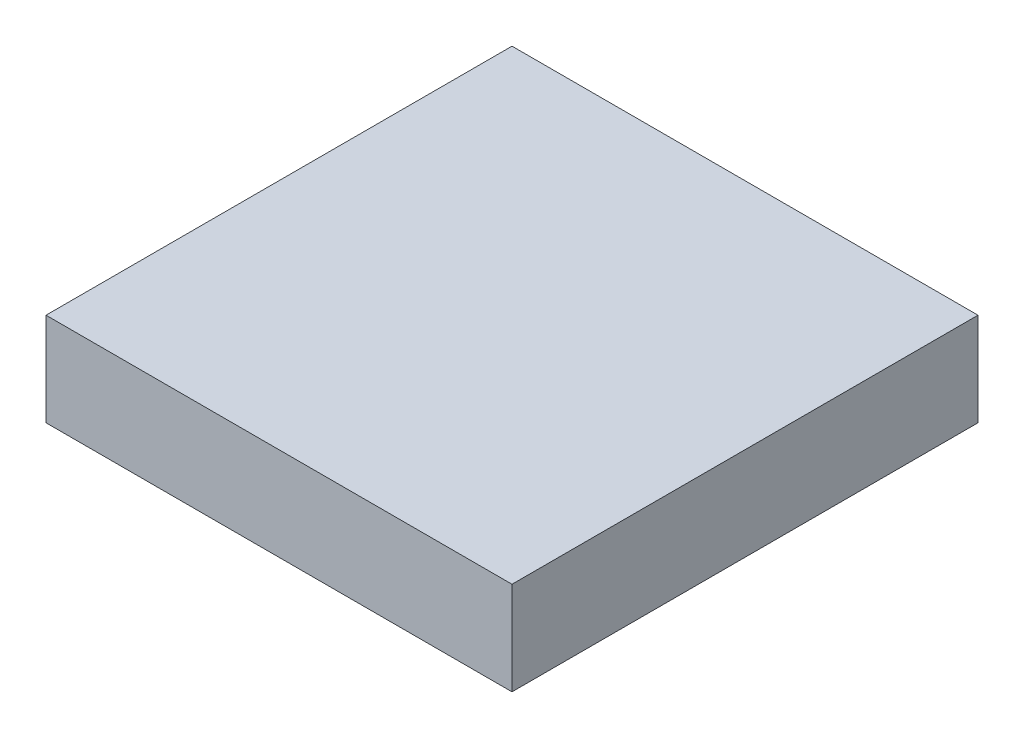
ISO-10303-21;
HEADER;
FILE_DESCRIPTION(('STEP AP214'),'2;1');
FILE_NAME('part.step','',(''),(''),'','','');
FILE_SCHEMA(('AUTOMOTIVE_DESIGN { 1 0 10303 214 1 1 1 1 }'));
ENDSEC;
DATA;
#1=APPLICATION_CONTEXT('core data for automotive mechanical design processes');
#2=APPLICATION_PROTOCOL_DEFINITION('international standard','automotive_design',2000,#1);
#3=PRODUCT_CONTEXT('',#1,'mechanical');
#4=PRODUCT('Part','Part','',(#3));
#5=PRODUCT_RELATED_PRODUCT_CATEGORY('part','',(#4));
#6=PRODUCT_DEFINITION_FORMATION('','',#4);
#7=PRODUCT_DEFINITION_CONTEXT('part definition',#1,'design');
#8=PRODUCT_DEFINITION('design','',#6,#7);
#9=PRODUCT_DEFINITION_SHAPE('','',#8);
#10=(LENGTH_UNIT() NAMED_UNIT(*) SI_UNIT(.MILLI.,.METRE.));
#11=(NAMED_UNIT(*) PLANE_ANGLE_UNIT() SI_UNIT($,.RADIAN.));
#12=(NAMED_UNIT(*) SI_UNIT($,.STERADIAN.) SOLID_ANGLE_UNIT());
#13=UNCERTAINTY_MEASURE_WITH_UNIT(LENGTH_MEASURE(1.E-05),#10,'distance_accuracy_value','');
#14=(GEOMETRIC_REPRESENTATION_CONTEXT(3) GLOBAL_UNCERTAINTY_ASSIGNED_CONTEXT((#13)) GLOBAL_UNIT_ASSIGNED_CONTEXT((#10,
#11,#12)) REPRESENTATION_CONTEXT('',''));
#15=CARTESIAN_POINT('',(0.,0.,0.));
#16=DIRECTION('',(0.,0.,1.));
#17=DIRECTION('',(1.,0.,0.));
#18=AXIS2_PLACEMENT_3D('',#15,#16,#17);
#19=CARTESIAN_POINT('',(8.,3.2,8.));
#20=DIRECTION('',(-1.,0.,0.));
#21=DIRECTION('',(0.,0.,1.));
#22=AXIS2_PLACEMENT_3D('',#19,#20,#21);
#23=PLANE('',#22);
#24=DIRECTION('',(0.,0.,-1.));
#25=VECTOR('',#24,1.);
#26=CARTESIAN_POINT('',(8.,0.,8.));
#27=LINE('',#26,#25);
#28=CARTESIAN_POINT('',(8.,0.,8.));
#29=VERTEX_POINT('',#28);
#30=CARTESIAN_POINT('',(8.,0.,-8.));
#31=VERTEX_POINT('',#30);
#32=EDGE_CURVE('E104',#29,#31,#27,.T.);
#33=ORIENTED_EDGE('',*,*,#32,.T.);
#34=DIRECTION('',(0.,-1.,0.));
#35=VECTOR('',#34,1.);
#36=CARTESIAN_POINT('',(8.,3.2,-8.));
#37=LINE('',#36,#35);
#38=CARTESIAN_POINT('',(8.,3.2,-8.));
#39=VERTEX_POINT('',#38);
#40=EDGE_CURVE('E11',#39,#31,#37,.T.);
#41=ORIENTED_EDGE('',*,*,#40,.F.);
#42=DIRECTION('',(0.,0.,-1.));
#43=VECTOR('',#42,1.);
#44=CARTESIAN_POINT('',(8.,3.2,8.));
#45=LINE('',#44,#43);
#46=CARTESIAN_POINT('',(8.,3.2,8.));
#47=VERTEX_POINT('',#46);
#48=EDGE_CURVE('E92',#47,#39,#45,.T.);
#49=ORIENTED_EDGE('',*,*,#48,.F.);
#50=DIRECTION('',(0.,-1.,0.));
#51=VECTOR('',#50,1.);
#52=CARTESIAN_POINT('',(8.,3.2,8.));
#53=LINE('',#52,#51);
#54=EDGE_CURVE('E100',#47,#29,#53,.T.);
#55=ORIENTED_EDGE('',*,*,#54,.T.);
#56=EDGE_LOOP('',(#33,#41,#49,#55));
#57=FACE_BOUND('',#56,.T.);
#58=ADVANCED_FACE('F41',(#57),#23,.F.);
#59=CARTESIAN_POINT('',(-8.,3.2,-8.));
#60=DIRECTION('',(0.,0.,1.));
#61=DIRECTION('',(1.,0.,0.));
#62=AXIS2_PLACEMENT_3D('',#59,#60,#61);
#63=PLANE('',#62);
#64=DIRECTION('',(-1.,0.,0.));
#65=VECTOR('',#64,1.);
#66=CARTESIAN_POINT('',(-8.,0.,-8.));
#67=LINE('',#66,#65);
#68=CARTESIAN_POINT('',(-8.,0.,-8.));
#69=VERTEX_POINT('',#68);
#70=EDGE_CURVE('E96',#31,#69,#67,.T.);
#71=ORIENTED_EDGE('',*,*,#70,.T.);
#72=DIRECTION('',(0.,-1.,0.));
#73=VECTOR('',#72,1.);
#74=CARTESIAN_POINT('',(-8.,3.2,-8.));
#75=LINE('',#74,#73);
#76=CARTESIAN_POINT('',(-8.,3.2,-8.));
#77=VERTEX_POINT('',#76);
#78=EDGE_CURVE('E49',#77,#69,#75,.T.);
#79=ORIENTED_EDGE('',*,*,#78,.F.);
#80=DIRECTION('',(-1.,0.,0.));
#81=VECTOR('',#80,1.);
#82=CARTESIAN_POINT('',(-8.,3.2,-8.));
#83=LINE('',#82,#81);
#84=EDGE_CURVE('E87',#39,#77,#83,.T.);
#85=ORIENTED_EDGE('',*,*,#84,.F.);
#86=ORIENTED_EDGE('',*,*,#40,.T.);
#87=EDGE_LOOP('',(#71,#79,#85,#86));
#88=FACE_BOUND('',#87,.T.);
#89=ADVANCED_FACE('F95',(#88),#63,.F.);
#90=CARTESIAN_POINT('',(-8.,3.2,8.));
#91=DIRECTION('',(1.,0.,0.));
#92=DIRECTION('',(0.,0.,-1.));
#93=AXIS2_PLACEMENT_3D('',#90,#91,#92);
#94=PLANE('',#93);
#95=DIRECTION('',(0.,0.,1.));
#96=VECTOR('',#95,1.);
#97=CARTESIAN_POINT('',(-8.,0.,8.));
#98=LINE('',#97,#96);
#99=CARTESIAN_POINT('',(-8.,0.,8.));
#100=VERTEX_POINT('',#99);
#101=EDGE_CURVE('E74',#69,#100,#98,.T.);
#102=ORIENTED_EDGE('',*,*,#101,.T.);
#103=DIRECTION('',(0.,-1.,0.));
#104=VECTOR('',#103,1.);
#105=CARTESIAN_POINT('',(-8.,3.2,8.));
#106=LINE('',#105,#104);
#107=CARTESIAN_POINT('',(-8.,3.2,8.));
#108=VERTEX_POINT('',#107);
#109=EDGE_CURVE('E97',#108,#100,#106,.T.);
#110=ORIENTED_EDGE('',*,*,#109,.F.);
#111=DIRECTION('',(0.,0.,1.));
#112=VECTOR('',#111,1.);
#113=CARTESIAN_POINT('',(-8.,3.2,8.));
#114=LINE('',#113,#112);
#115=EDGE_CURVE('E90',#77,#108,#114,.T.);
#116=ORIENTED_EDGE('',*,*,#115,.F.);
#117=ORIENTED_EDGE('',*,*,#78,.T.);
#118=EDGE_LOOP('',(#102,#110,#116,#117));
#119=FACE_BOUND('',#118,.T.);
#120=ADVANCED_FACE('F98',(#119),#94,.F.);
#121=CARTESIAN_POINT('',(-8.,3.2,8.));
#122=DIRECTION('',(0.,0.,-1.));
#123=DIRECTION('',(-1.,0.,0.));
#124=AXIS2_PLACEMENT_3D('',#121,#122,#123);
#125=PLANE('',#124);
#126=DIRECTION('',(1.,0.,0.));
#127=VECTOR('',#126,1.);
#128=CARTESIAN_POINT('',(-8.,0.,8.));
#129=LINE('',#128,#127);
#130=EDGE_CURVE('E80',#100,#29,#129,.T.);
#131=ORIENTED_EDGE('',*,*,#130,.T.);
#132=ORIENTED_EDGE('',*,*,#54,.F.);
#133=DIRECTION('',(1.,0.,0.));
#134=VECTOR('',#133,1.);
#135=CARTESIAN_POINT('',(-8.,3.2,8.));
#136=LINE('',#135,#134);
#137=EDGE_CURVE('E57',#108,#47,#136,.T.);
#138=ORIENTED_EDGE('',*,*,#137,.F.);
#139=ORIENTED_EDGE('',*,*,#109,.T.);
#140=EDGE_LOOP('',(#131,#132,#138,#139));
#141=FACE_BOUND('',#140,.T.);
#142=ADVANCED_FACE('F111',(#141),#125,.F.);
#143=CARTESIAN_POINT('',(0.,3.2,0.));
#144=DIRECTION('',(0.,-1.,0.));
#145=DIRECTION('',(0.,0.,-1.));
#146=AXIS2_PLACEMENT_3D('',#143,#144,#145);
#147=PLANE('',#146);
#148=ORIENTED_EDGE('',*,*,#48,.T.);
#149=ORIENTED_EDGE('',*,*,#84,.T.);
#150=ORIENTED_EDGE('',*,*,#115,.T.);
#151=ORIENTED_EDGE('',*,*,#137,.T.);
#152=EDGE_LOOP('',(#148,#149,#150,#151));
#153=FACE_BOUND('',#152,.T.);
#154=ADVANCED_FACE('F88',(#153),#147,.F.);
#155=CARTESIAN_POINT('',(0.,0.,0.));
#156=DIRECTION('',(0.,-1.,0.));
#157=DIRECTION('',(0.,0.,-1.));
#158=AXIS2_PLACEMENT_3D('',#155,#156,#157);
#159=PLANE('',#158);
#160=ORIENTED_EDGE('',*,*,#32,.F.);
#161=ORIENTED_EDGE('',*,*,#130,.F.);
#162=ORIENTED_EDGE('',*,*,#101,.F.);
#163=ORIENTED_EDGE('',*,*,#70,.F.);
#164=EDGE_LOOP('',(#160,#161,#162,#163));
#165=FACE_BOUND('',#164,.T.);
#166=ADVANCED_FACE('F114',(#165),#159,.T.);
#167=CLOSED_SHELL('',(#58,#89,#120,#142,#154,#166));
#168=MANIFOLD_SOLID_BREP('B2',#167);
#169=ADVANCED_BREP_SHAPE_REPRESENTATION('',(#18,#168),#14);
#170=SHAPE_DEFINITION_REPRESENTATION(#9,#169);
ENDSEC;
END-ISO-10303-21;
